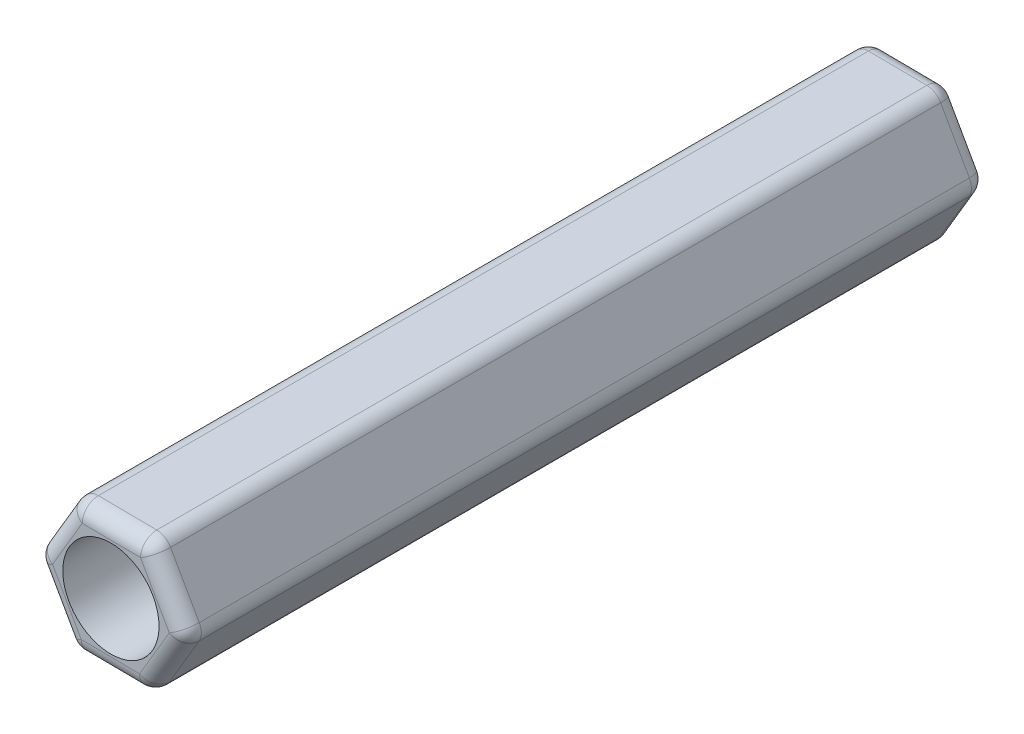
ISO-10303-21;
HEADER;
FILE_DESCRIPTION(('STEP AP214'),'2;1');
FILE_NAME('part.step','',(''),(''),'','','');
FILE_SCHEMA(('AUTOMOTIVE_DESIGN { 1 0 10303 214 1 1 1 1 }'));
ENDSEC;
DATA;
#1=APPLICATION_CONTEXT('core data for automotive mechanical design processes');
#2=APPLICATION_PROTOCOL_DEFINITION('international standard','automotive_design',2000,#1);
#3=PRODUCT_CONTEXT('',#1,'mechanical');
#4=PRODUCT('Part','Part','',(#3));
#5=PRODUCT_RELATED_PRODUCT_CATEGORY('part','',(#4));
#6=PRODUCT_DEFINITION_FORMATION('','',#4);
#7=PRODUCT_DEFINITION_CONTEXT('part definition',#1,'design');
#8=PRODUCT_DEFINITION('design','',#6,#7);
#9=PRODUCT_DEFINITION_SHAPE('','',#8);
#10=(LENGTH_UNIT() NAMED_UNIT(*) SI_UNIT(.MILLI.,.METRE.));
#11=(NAMED_UNIT(*) PLANE_ANGLE_UNIT() SI_UNIT($,.RADIAN.));
#12=(NAMED_UNIT(*) SI_UNIT($,.STERADIAN.) SOLID_ANGLE_UNIT());
#13=UNCERTAINTY_MEASURE_WITH_UNIT(LENGTH_MEASURE(1.E-05),#10,'distance_accuracy_value','');
#14=(GEOMETRIC_REPRESENTATION_CONTEXT(3) GLOBAL_UNCERTAINTY_ASSIGNED_CONTEXT((#13)) GLOBAL_UNIT_ASSIGNED_CONTEXT((#10,
#11,#12)) REPRESENTATION_CONTEXT('',''));
#15=CARTESIAN_POINT('',(0.,0.,0.));
#16=DIRECTION('',(0.,0.,1.));
#17=DIRECTION('',(1.,0.,0.));
#18=AXIS2_PLACEMENT_3D('',#15,#16,#17);
#19=CARTESIAN_POINT('',(-1.21773260801351,-2.06348264560523,25.));
#20=DIRECTION('',(0.0095350652187517,0.999954540232342,0.));
#21=DIRECTION('',(-0.999954540232342,0.0095350652187517,0.));
#22=AXIS2_PLACEMENT_3D('',#19,#20,#21);
#23=PLANE('',#22);
#24=DIRECTION('',(0.,0.,-1.));
#25=VECTOR('',#24,1.);
#26=CARTESIAN_POINT('',(0.889500075865425,-2.0835761601236,25.));
#27=LINE('',#26,#25);
#28=CARTESIAN_POINT('',(0.889500075865425,-2.0835761601236,0.5));
#29=VERTEX_POINT('',#28);
#30=CARTESIAN_POINT('',(0.889500075865425,-2.0835761601236,24.5));
#31=VERTEX_POINT('',#30);
#32=EDGE_CURVE('E240',#29,#31,#27,.F.);
#33=ORIENTED_EDGE('',*,*,#32,.T.);
#34=DIRECTION('',(0.999954540232342,-0.0095350652187517,0.));
#35=VECTOR('',#34,1.);
#36=CARTESIAN_POINT('',(-1.21773260801351,-2.06348264560523,24.5));
#37=LINE('',#36,#35);
#38=CARTESIAN_POINT('',(-0.929070596523247,-2.06623518184062,24.5));
#39=VERTEX_POINT('',#38);
#40=EDGE_CURVE('E242',#31,#39,#37,.F.);
#41=ORIENTED_EDGE('',*,*,#40,.T.);
#42=DIRECTION('',(0.,0.,-1.));
#43=VECTOR('',#42,1.);
#44=CARTESIAN_POINT('',(-0.929070596523247,-2.06623518184062,25.));
#45=LINE('',#44,#43);
#46=CARTESIAN_POINT('',(-0.929070596523247,-2.06623518184062,0.5));
#47=VERTEX_POINT('',#46);
#48=EDGE_CURVE('E236',#39,#47,#45,.T.);
#49=ORIENTED_EDGE('',*,*,#48,.T.);
#50=DIRECTION('',(0.999954540232342,-0.0095350652187517,0.));
#51=VECTOR('',#50,1.);
#52=CARTESIAN_POINT('',(-1.21773260801351,-2.06348264560523,0.5));
#53=LINE('',#52,#51);
#54=EDGE_CURVE('E238',#47,#29,#53,.T.);
#55=ORIENTED_EDGE('',*,*,#54,.T.);
#56=EDGE_LOOP('',(#33,#41,#49,#55));
#57=FACE_BOUND('',#56,.T.);
#58=ADVANCED_FACE('F32',(#57),#23,.F.);
#59=CARTESIAN_POINT('',(1.17816208735569,-2.08632869635899,25.));
#60=DIRECTION('',(-0.861218501861421,0.508234878822351,0.));
#61=DIRECTION('',(-0.508234878822351,-0.861218501861421,0.));
#62=AXIS2_PLACEMENT_3D('',#59,#60,#61);
#63=PLANE('',#62);
#64=DIRECTION('',(0.,0.,-1.));
#65=VECTOR('',#64,1.);
#66=CARTESIAN_POINT('',(2.24917992331938,-0.271458417694153,25.));
#67=LINE('',#66,#65);
#68=CARTESIAN_POINT('',(2.24917992331938,-0.271458417694153,0.5));
#69=VERTEX_POINT('',#68);
#70=CARTESIAN_POINT('',(2.24917992331938,-0.271458417694153,24.5));
#71=VERTEX_POINT('',#70);
#72=EDGE_CURVE('E231',#69,#71,#67,.F.);
#73=ORIENTED_EDGE('',*,*,#72,.T.);
#74=DIRECTION('',(0.508234878822351,0.861218501861421,0.));
#75=VECTOR('',#74,1.);
#76=CARTESIAN_POINT('',(1.17816208735569,-2.08632869635899,24.5));
#77=LINE('',#76,#75);
#78=CARTESIAN_POINT('',(1.32487685940551,-1.83771632941861,24.5));
#79=VERTEX_POINT('',#78);
#80=EDGE_CURVE('E233',#71,#79,#77,.F.);
#81=ORIENTED_EDGE('',*,*,#80,.T.);
#82=DIRECTION('',(0.,0.,-1.));
#83=VECTOR('',#82,1.);
#84=CARTESIAN_POINT('',(1.32487685940551,-1.83771632941861,25.));
#85=LINE('',#84,#83);
#86=CARTESIAN_POINT('',(1.32487685940551,-1.83771632941861,0.5));
#87=VERTEX_POINT('',#86);
#88=EDGE_CURVE('E227',#79,#87,#85,.T.);
#89=ORIENTED_EDGE('',*,*,#88,.T.);
#90=DIRECTION('',(0.508234878822351,0.861218501861421,0.));
#91=VECTOR('',#90,1.);
#92=CARTESIAN_POINT('',(1.17816208735569,-2.08632869635899,0.5));
#93=LINE('',#92,#91);
#94=EDGE_CURVE('E229',#87,#69,#93,.T.);
#95=ORIENTED_EDGE('',*,*,#94,.T.);
#96=EDGE_LOOP('',(#73,#81,#89,#95));
#97=FACE_BOUND('',#96,.T.);
#98=ADVANCED_FACE('F447',(#97),#63,.F.);
#99=CARTESIAN_POINT('',(2.3958946953692,-0.0228460507537645,25.));
#100=DIRECTION('',(-0.870753567080172,-0.49171966140999,0.));
#101=DIRECTION('',(0.49171966140999,-0.870753567080172,0.));
#102=AXIS2_PLACEMENT_3D('',#99,#100,#101);
#103=PLANE('',#102);
#104=DIRECTION('',(0.,0.,-1.));
#105=VECTOR('',#104,1.);
#106=CARTESIAN_POINT('',(1.35967984745396,1.81211774242945,25.));
#107=LINE('',#106,#105);
#108=CARTESIAN_POINT('',(1.35967984745396,1.81211774242945,0.5));
#109=VERTEX_POINT('',#108);
#110=CARTESIAN_POINT('',(1.35967984745396,1.81211774242945,24.5));
#111=VERTEX_POINT('',#110);
#112=EDGE_CURVE('E222',#109,#111,#107,.F.);
#113=ORIENTED_EDGE('',*,*,#112,.T.);
#114=DIRECTION('',(-0.49171966140999,0.870753567080172,0.));
#115=VECTOR('',#114,1.);
#116=CARTESIAN_POINT('',(2.3958946953692,-0.0228460507537646,24.5));
#117=LINE('',#116,#115);
#118=CARTESIAN_POINT('',(2.25394745592876,0.228518852422018,24.5));
#119=VERTEX_POINT('',#118);
#120=EDGE_CURVE('E224',#111,#119,#117,.F.);
#121=ORIENTED_EDGE('',*,*,#120,.T.);
#122=DIRECTION('',(0.,0.,-1.));
#123=VECTOR('',#122,1.);
#124=CARTESIAN_POINT('',(2.25394745592876,0.228518852422018,25.));
#125=LINE('',#124,#123);
#126=CARTESIAN_POINT('',(2.25394745592876,0.228518852422018,0.5));
#127=VERTEX_POINT('',#126);
#128=EDGE_CURVE('E218',#119,#127,#125,.T.);
#129=ORIENTED_EDGE('',*,*,#128,.T.);
#130=DIRECTION('',(-0.49171966140999,0.870753567080172,0.));
#131=VECTOR('',#130,1.);
#132=CARTESIAN_POINT('',(2.3958946953692,-0.0228460507537645,0.5));
#133=LINE('',#132,#131);
#134=EDGE_CURVE('E220',#127,#109,#133,.T.);
#135=ORIENTED_EDGE('',*,*,#134,.T.);
#136=EDGE_LOOP('',(#113,#121,#129,#135));
#137=FACE_BOUND('',#136,.T.);
#138=ADVANCED_FACE('F452',(#137),#103,.F.);
#139=CARTESIAN_POINT('',(1.21773260801351,2.06348264560523,25.));
#140=DIRECTION('',(-0.00953506521875152,-0.999954540232342,0.));
#141=DIRECTION('',(0.999954540232342,-0.00953506521875152,0.));
#142=AXIS2_PLACEMENT_3D('',#139,#140,#141);
#143=PLANE('',#142);
#144=DIRECTION('',(-0.999954540232342,0.00953506521875152,0.));
#145=VECTOR('',#144,1.);
#146=CARTESIAN_POINT('',(1.21773260801351,2.06348264560523,24.5));
#147=LINE('',#146,#145);
#148=CARTESIAN_POINT('',(-0.889500075865427,2.0835761601236,24.5));
#149=VERTEX_POINT('',#148);
#150=CARTESIAN_POINT('',(0.929070596523245,2.06623518184062,24.5));
#151=VERTEX_POINT('',#150);
#152=EDGE_CURVE('E164',#149,#151,#147,.F.);
#153=ORIENTED_EDGE('',*,*,#152,.T.);
#154=DIRECTION('',(0.,0.,-1.));
#155=VECTOR('',#154,1.);
#156=CARTESIAN_POINT('',(0.929070596523245,2.06623518184062,25.));
#157=LINE('',#156,#155);
#158=CARTESIAN_POINT('',(0.929070596523245,2.06623518184062,0.5));
#159=VERTEX_POINT('',#158);
#160=EDGE_CURVE('E203',#151,#159,#157,.T.);
#161=ORIENTED_EDGE('',*,*,#160,.T.);
#162=DIRECTION('',(-0.999954540232342,0.00953506521875152,0.));
#163=VECTOR('',#162,1.);
#164=CARTESIAN_POINT('',(1.21773260801351,2.06348264560523,0.5));
#165=LINE('',#164,#163);
#166=CARTESIAN_POINT('',(-0.889500075865427,2.0835761601236,0.5));
#167=VERTEX_POINT('',#166);
#168=EDGE_CURVE('E195',#159,#167,#165,.T.);
#169=ORIENTED_EDGE('',*,*,#168,.T.);
#170=DIRECTION('',(0.,0.,-1.));
#171=VECTOR('',#170,1.);
#172=CARTESIAN_POINT('',(-0.889500075865427,2.0835761601236,25.));
#173=LINE('',#172,#171);
#174=EDGE_CURVE('E193',#167,#149,#173,.F.);
#175=ORIENTED_EDGE('',*,*,#174,.T.);
#176=EDGE_LOOP('',(#153,#161,#169,#175));
#177=FACE_BOUND('',#176,.T.);
#178=ADVANCED_FACE('F387',(#177),#143,.F.);
#179=CARTESIAN_POINT('',(-1.17816208735569,2.08632869635899,25.));
#180=DIRECTION('',(0.861218501861421,-0.508234878822351,0.));
#181=DIRECTION('',(0.508234878822351,0.861218501861421,0.));
#182=AXIS2_PLACEMENT_3D('',#179,#180,#181);
#183=PLANE('',#182);
#184=DIRECTION('',(-0.508234878822351,-0.861218501861421,0.));
#185=VECTOR('',#184,1.);
#186=CARTESIAN_POINT('',(-1.17816208735569,2.08632869635899,24.5));
#187=LINE('',#186,#185);
#188=CARTESIAN_POINT('',(-2.24917992331939,0.271458417694154,24.5));
#189=VERTEX_POINT('',#188);
#190=CARTESIAN_POINT('',(-1.32487685940551,1.83771632941861,24.5));
#191=VERTEX_POINT('',#190);
#192=EDGE_CURVE('E41',#189,#191,#187,.F.);
#193=ORIENTED_EDGE('',*,*,#192,.T.);
#194=DIRECTION('',(0.,0.,-1.));
#195=VECTOR('',#194,1.);
#196=CARTESIAN_POINT('',(-1.32487685940551,1.83771632941861,25.));
#197=LINE('',#196,#195);
#198=CARTESIAN_POINT('',(-1.32487685940551,1.83771632941861,0.5));
#199=VERTEX_POINT('',#198);
#200=EDGE_CURVE('E11',#191,#199,#197,.T.);
#201=ORIENTED_EDGE('',*,*,#200,.T.);
#202=DIRECTION('',(-0.508234878822351,-0.861218501861421,0.));
#203=VECTOR('',#202,1.);
#204=CARTESIAN_POINT('',(-1.17816208735569,2.08632869635899,0.5));
#205=LINE('',#204,#203);
#206=CARTESIAN_POINT('',(-2.24917992331939,0.271458417694154,0.5));
#207=VERTEX_POINT('',#206);
#208=EDGE_CURVE('E254',#199,#207,#205,.T.);
#209=ORIENTED_EDGE('',*,*,#208,.T.);
#210=DIRECTION('',(0.,0.,-1.));
#211=VECTOR('',#210,1.);
#212=CARTESIAN_POINT('',(-2.24917992331939,0.271458417694153,25.));
#213=LINE('',#212,#211);
#214=EDGE_CURVE('E52',#207,#189,#213,.F.);
#215=ORIENTED_EDGE('',*,*,#214,.T.);
#216=EDGE_LOOP('',(#193,#201,#209,#215));
#217=FACE_BOUND('',#216,.T.);
#218=ADVANCED_FACE('F393',(#217),#183,.F.);
#219=CARTESIAN_POINT('',(-2.39589469536921,0.0228460507537649,25.));
#220=DIRECTION('',(0.870753567080172,0.491719661409991,0.));
#221=DIRECTION('',(-0.491719661409991,0.870753567080172,0.));
#222=AXIS2_PLACEMENT_3D('',#219,#220,#221);
#223=PLANE('',#222);
#224=DIRECTION('',(0.,0.,-1.));
#225=VECTOR('',#224,1.);
#226=CARTESIAN_POINT('',(-1.35967984745396,-1.81211774242945,25.));
#227=LINE('',#226,#225);
#228=CARTESIAN_POINT('',(-1.35967984745396,-1.81211774242945,0.5));
#229=VERTEX_POINT('',#228);
#230=CARTESIAN_POINT('',(-1.35967984745396,-1.81211774242945,24.5));
#231=VERTEX_POINT('',#230);
#232=EDGE_CURVE('E249',#229,#231,#227,.F.);
#233=ORIENTED_EDGE('',*,*,#232,.T.);
#234=DIRECTION('',(0.491719661409991,-0.870753567080172,0.));
#235=VECTOR('',#234,1.);
#236=CARTESIAN_POINT('',(-2.39589469536921,0.0228460507537649,24.5));
#237=LINE('',#236,#235);
#238=CARTESIAN_POINT('',(-2.25394745592876,-0.228518852422018,24.5));
#239=VERTEX_POINT('',#238);
#240=EDGE_CURVE('E251',#231,#239,#237,.F.);
#241=ORIENTED_EDGE('',*,*,#240,.T.);
#242=DIRECTION('',(0.,0.,-1.));
#243=VECTOR('',#242,1.);
#244=CARTESIAN_POINT('',(-2.25394745592876,-0.228518852422018,25.));
#245=LINE('',#244,#243);
#246=CARTESIAN_POINT('',(-2.25394745592876,-0.228518852422018,0.5));
#247=VERTEX_POINT('',#246);
#248=EDGE_CURVE('E245',#239,#247,#245,.T.);
#249=ORIENTED_EDGE('',*,*,#248,.T.);
#250=DIRECTION('',(0.491719661409991,-0.870753567080172,0.));
#251=VECTOR('',#250,1.);
#252=CARTESIAN_POINT('',(-2.39589469536921,0.0228460507537649,0.5));
#253=LINE('',#252,#251);
#254=EDGE_CURVE('E247',#247,#229,#253,.T.);
#255=ORIENTED_EDGE('',*,*,#254,.T.);
#256=EDGE_LOOP('',(#233,#241,#249,#255));
#257=FACE_BOUND('',#256,.T.);
#258=ADVANCED_FACE('F717',(#257),#223,.F.);
#259=CARTESIAN_POINT('',(0.,0.,25.));
#260=DIRECTION('',(0.,0.,1.));
#261=DIRECTION('',(1.,0.,0.));
#262=AXIS2_PLACEMENT_3D('',#259,#260,#261);
#263=PLANE('',#262);
#264=DIRECTION('',(-0.49171966140999,0.870753567080172,0.));
#265=VECTOR('',#264,1.);
#266=CARTESIAN_POINT('',(0.782355824473424,1.81762281490023,25.));
#267=LINE('',#266,#265);
#268=CARTESIAN_POINT('',(1.81857067238867,-0.0173409782829781,25.));
#269=VERTEX_POINT('',#268);
#270=CARTESIAN_POINT('',(0.924303063913868,1.56625791172445,25.));
#271=VERTEX_POINT('',#270);
#272=EDGE_CURVE('E191',#269,#271,#267,.T.);
#273=ORIENTED_EDGE('',*,*,#272,.T.);
#274=DIRECTION('',(-0.999954540232342,0.00953506521875152,0.));
#275=VECTOR('',#274,1.);
#276=CARTESIAN_POINT('',(-1.18292961996507,1.58635142624282,25.));
#277=LINE('',#276,#275);
#278=CARTESIAN_POINT('',(-0.894267608474803,1.58359889000743,25.));
#279=VERTEX_POINT('',#278);
#280=EDGE_CURVE('E162',#271,#279,#277,.T.);
#281=ORIENTED_EDGE('',*,*,#280,.T.);
#282=DIRECTION('',(-0.508234878822351,-0.861218501861421,0.));
#283=VECTOR('',#282,1.);
#284=CARTESIAN_POINT('',(-1.9652854444385,-0.231271388657411,25.));
#285=LINE('',#284,#283);
#286=CARTESIAN_POINT('',(-1.81857067238867,0.0173409782829782,25.));
#287=VERTEX_POINT('',#286);
#288=EDGE_CURVE('E179',#279,#287,#285,.T.);
#289=ORIENTED_EDGE('',*,*,#288,.T.);
#290=DIRECTION('',(0.491719661409991,-0.870753567080172,0.));
#291=VECTOR('',#290,1.);
#292=CARTESIAN_POINT('',(-0.782355824473426,-1.81762281490023,25.));
#293=LINE('',#292,#291);
#294=CARTESIAN_POINT('',(-0.924303063913871,-1.56625791172445,25.));
#295=VERTEX_POINT('',#294);
#296=EDGE_CURVE('E185',#287,#295,#293,.T.);
#297=ORIENTED_EDGE('',*,*,#296,.T.);
#298=DIRECTION('',(0.999954540232342,-0.0095350652187517,0.));
#299=VECTOR('',#298,1.);
#300=CARTESIAN_POINT('',(1.18292961996507,-1.58635142624282,25.));
#301=LINE('',#300,#299);
#302=CARTESIAN_POINT('',(0.894267608474801,-1.58359889000743,25.));
#303=VERTEX_POINT('',#302);
#304=EDGE_CURVE('E360',#295,#303,#301,.T.);
#305=ORIENTED_EDGE('',*,*,#304,.T.);
#306=DIRECTION('',(0.508234878822351,0.861218501861421,0.));
#307=VECTOR('',#306,1.);
#308=CARTESIAN_POINT('',(1.96528544443849,0.231271388657411,25.));
#309=LINE('',#308,#307);
#310=EDGE_CURVE('E197',#303,#269,#309,.T.);
#311=ORIENTED_EDGE('',*,*,#310,.T.);
#312=EDGE_LOOP('',(#273,#281,#289,#297,#305,#311));
#313=FACE_BOUND('',#312,.T.);
#314=CARTESIAN_POINT('',(0.,0.,25.));
#315=DIRECTION('',(0.,0.,1.));
#316=DIRECTION('',(1.,0.,0.));
#317=AXIS2_PLACEMENT_3D('',#314,#315,#316);
#318=CIRCLE('',#317,1.5);
#319=CARTESIAN_POINT('',(1.5,0.,25.));
#320=VERTEX_POINT('',#319);
#321=EDGE_CURVE('E347',#320,#320,#318,.T.);
#322=ORIENTED_EDGE('',*,*,#321,.F.);
#323=EDGE_LOOP('',(#322));
#324=FACE_BOUND('',#323,.T.);
#325=ADVANCED_FACE('F188',(#313,#324),#263,.T.);
#326=CARTESIAN_POINT('',(0.,0.,0.));
#327=DIRECTION('',(0.,0.,1.));
#328=DIRECTION('',(1.,0.,0.));
#329=AXIS2_PLACEMENT_3D('',#326,#327,#328);
#330=PLANE('',#329);
#331=DIRECTION('',(-0.508234878822351,-0.861218501861421,0.));
#332=VECTOR('',#331,1.);
#333=CARTESIAN_POINT('',(-1.35641914043174,0.800469934145204,0.));
#334=LINE('',#333,#332);
#335=CARTESIAN_POINT('',(-1.81857067238867,0.0173409782829779,0.));
#336=VERTEX_POINT('',#335);
#337=CARTESIAN_POINT('',(-0.894267608474802,1.58359889000743,0.));
#338=VERTEX_POINT('',#337);
#339=EDGE_CURVE('E205',#336,#338,#334,.F.);
#340=ORIENTED_EDGE('',*,*,#339,.T.);
#341=DIRECTION('',(-0.999954540232342,0.00953506521875152,0.));
#342=VECTOR('',#341,1.);
#343=CARTESIAN_POINT('',(0.0150177277195337,1.57492840086594,0.));
#344=LINE('',#343,#342);
#345=CARTESIAN_POINT('',(0.924303063913869,1.56625791172445,0.));
#346=VERTEX_POINT('',#345);
#347=EDGE_CURVE('E215',#338,#346,#344,.F.);
#348=ORIENTED_EDGE('',*,*,#347,.T.);
#349=DIRECTION('',(-0.49171966140999,0.870753567080172,0.));
#350=VECTOR('',#349,1.);
#351=CARTESIAN_POINT('',(1.37143686815127,0.774458466720735,0.));
#352=LINE('',#351,#350);
#353=CARTESIAN_POINT('',(1.81857067238867,-0.0173409782829776,0.));
#354=VERTEX_POINT('',#353);
#355=EDGE_CURVE('E213',#346,#354,#352,.F.);
#356=ORIENTED_EDGE('',*,*,#355,.T.);
#357=DIRECTION('',(0.508234878822351,0.861218501861421,0.));
#358=VECTOR('',#357,1.);
#359=CARTESIAN_POINT('',(1.35641914043174,-0.800469934145203,0.));
#360=LINE('',#359,#358);
#361=CARTESIAN_POINT('',(0.894267608474801,-1.58359889000743,0.));
#362=VERTEX_POINT('',#361);
#363=EDGE_CURVE('E211',#354,#362,#360,.F.);
#364=ORIENTED_EDGE('',*,*,#363,.T.);
#365=DIRECTION('',(0.999954540232342,-0.0095350652187517,0.));
#366=VECTOR('',#365,1.);
#367=CARTESIAN_POINT('',(-0.0150177277195339,-1.57492840086594,0.));
#368=LINE('',#367,#366);
#369=CARTESIAN_POINT('',(-0.924303063913871,-1.56625791172445,0.));
#370=VERTEX_POINT('',#369);
#371=EDGE_CURVE('E209',#362,#370,#368,.F.);
#372=ORIENTED_EDGE('',*,*,#371,.T.);
#373=DIRECTION('',(0.491719661409991,-0.870753567080172,0.));
#374=VECTOR('',#373,1.);
#375=CARTESIAN_POINT('',(-1.37143686815127,-0.774458466720736,0.));
#376=LINE('',#375,#374);
#377=EDGE_CURVE('E207',#370,#336,#376,.F.);
#378=ORIENTED_EDGE('',*,*,#377,.T.);
#379=EDGE_LOOP('',(#340,#348,#356,#364,#372,#378));
#380=FACE_BOUND('',#379,.T.);
#381=CARTESIAN_POINT('',(0.,0.,0.));
#382=DIRECTION('',(0.,0.,1.));
#383=DIRECTION('',(1.,0.,0.));
#384=AXIS2_PLACEMENT_3D('',#381,#382,#383);
#385=CIRCLE('',#384,1.5);
#386=CARTESIAN_POINT('',(1.5,0.,0.));
#387=VERTEX_POINT('',#386);
#388=EDGE_CURVE('E186',#387,#387,#385,.T.);
#389=ORIENTED_EDGE('',*,*,#388,.T.);
#390=EDGE_LOOP('',(#389));
#391=FACE_BOUND('',#390,.T.);
#392=ADVANCED_FACE('F701',(#380,#391),#330,.F.);
#393=CARTESIAN_POINT('',(0.,0.,0.));
#394=DIRECTION('',(0.,0.,1.));
#395=DIRECTION('',(1.,0.,0.));
#396=AXIS2_PLACEMENT_3D('',#393,#394,#395);
#397=CYLINDRICAL_SURFACE('',#396,1.5);
#398=ORIENTED_EDGE('',*,*,#388,.F.);
#399=EDGE_LOOP('',(#398));
#400=FACE_BOUND('',#399,.T.);
#401=ORIENTED_EDGE('',*,*,#321,.T.);
#402=EDGE_LOOP('',(#401));
#403=FACE_BOUND('',#402,.T.);
#404=ADVANCED_FACE('F692',(#400,#403),#397,.F.);
#405=CARTESIAN_POINT('',(-1.21296507540414,-1.56350537548906,0.5));
#406=DIRECTION('',(0.999954540232342,-0.0095350652187517,0.));
#407=DIRECTION('',(0.0095350652187517,0.999954540232342,0.));
#408=AXIS2_PLACEMENT_3D('',#405,#406,#407);
#409=CYLINDRICAL_SURFACE('',#408,0.5);
#410=CARTESIAN_POINT('',(0.894267608474801,-1.58359889000743,0.5));
#411=DIRECTION('',(0.999954540232342,-0.00953506521875159,0.));
#412=DIRECTION('',(0.00953506521875159,0.999954540232342,0.));
#413=AXIS2_PLACEMENT_3D('',#410,#411,#412);
#414=CIRCLE('',#413,0.5);
#415=EDGE_CURVE('E36',#29,#362,#414,.T.);
#416=ORIENTED_EDGE('',*,*,#415,.F.);
#417=ORIENTED_EDGE('',*,*,#54,.F.);
#418=CARTESIAN_POINT('',(-0.924303063913871,-1.56625791172445,0.5));
#419=DIRECTION('',(-0.999954540232342,0.00953506521875224,0.));
#420=DIRECTION('',(-0.00953506521875225,-0.999954540232342,0.));
#421=AXIS2_PLACEMENT_3D('',#418,#419,#420);
#422=CIRCLE('',#421,0.5);
#423=EDGE_CURVE('E340',#370,#47,#422,.T.);
#424=ORIENTED_EDGE('',*,*,#423,.F.);
#425=ORIENTED_EDGE('',*,*,#371,.F.);
#426=EDGE_LOOP('',(#416,#417,#424,#425));
#427=FACE_BOUND('',#426,.T.);
#428=ADVANCED_FACE('F34',(#427),#409,.T.);
#429=CARTESIAN_POINT('',(0.894267608474801,-1.58359889000743,0.5));
#430=DIRECTION('',(0.,0.,1.));
#431=DIRECTION('',(1.,0.,0.));
#432=AXIS2_PLACEMENT_3D('',#429,#430,#431);
#433=SPHERICAL_SURFACE('',#432,0.5);
#434=CARTESIAN_POINT('',(0.894267608474801,-1.58359889000743,0.5));
#435=DIRECTION('',(0.,0.,-1.));
#436=DIRECTION('',(-1.,0.,0.));
#437=AXIS2_PLACEMENT_3D('',#434,#435,#436);
#438=CIRCLE('',#437,0.5);
#439=EDGE_CURVE('E335',#29,#87,#438,.F.);
#440=ORIENTED_EDGE('',*,*,#439,.F.);
#441=ORIENTED_EDGE('',*,*,#415,.T.);
#442=CARTESIAN_POINT('',(0.894267608474801,-1.58359889000743,0.5));
#443=DIRECTION('',(-0.508234878822351,-0.861218501861421,0.));
#444=DIRECTION('',(0.861218501861421,-0.508234878822351,0.));
#445=AXIS2_PLACEMENT_3D('',#442,#443,#444);
#446=CIRCLE('',#445,0.5);
#447=EDGE_CURVE('E338',#87,#362,#446,.F.);
#448=ORIENTED_EDGE('',*,*,#447,.F.);
#449=EDGE_LOOP('',(#440,#441,#448));
#450=FACE_BOUND('',#449,.T.);
#451=ADVANCED_FACE('F678',(#450),#433,.T.);
#452=CARTESIAN_POINT('',(-0.924303063913871,-1.56625791172445,0.5));
#453=DIRECTION('',(0.,0.,1.));
#454=DIRECTION('',(1.,0.,0.));
#455=AXIS2_PLACEMENT_3D('',#452,#453,#454);
#456=SPHERICAL_SURFACE('',#455,0.5);
#457=CARTESIAN_POINT('',(-0.924303063913871,-1.56625791172445,0.5));
#458=DIRECTION('',(0.491719661409991,-0.870753567080172,0.));
#459=DIRECTION('',(0.870753567080172,0.491719661409991,0.));
#460=AXIS2_PLACEMENT_3D('',#457,#458,#459);
#461=CIRCLE('',#460,0.5);
#462=EDGE_CURVE('E329',#370,#229,#461,.F.);
#463=ORIENTED_EDGE('',*,*,#462,.F.);
#464=ORIENTED_EDGE('',*,*,#423,.T.);
#465=CARTESIAN_POINT('',(-0.924303063913871,-1.56625791172445,0.5));
#466=DIRECTION('',(0.,0.,-1.));
#467=DIRECTION('',(-1.,0.,0.));
#468=AXIS2_PLACEMENT_3D('',#465,#466,#467);
#469=CIRCLE('',#468,0.5);
#470=EDGE_CURVE('E332',#229,#47,#469,.F.);
#471=ORIENTED_EDGE('',*,*,#470,.F.);
#472=EDGE_LOOP('',(#463,#464,#471));
#473=FACE_BOUND('',#472,.T.);
#474=ADVANCED_FACE('F669',(#473),#456,.T.);
#475=CARTESIAN_POINT('',(0.74755283642498,-1.83221125694782,0.5));
#476=DIRECTION('',(0.508234878822351,0.861218501861421,0.));
#477=DIRECTION('',(-0.861218501861421,0.508234878822351,0.));
#478=AXIS2_PLACEMENT_3D('',#475,#476,#477);
#479=CYLINDRICAL_SURFACE('',#478,0.5);
#480=ORIENTED_EDGE('',*,*,#447,.T.);
#481=ORIENTED_EDGE('',*,*,#363,.F.);
#482=CARTESIAN_POINT('',(1.81857067238867,-0.0173409782829775,0.5));
#483=DIRECTION('',(0.508234878822351,0.861218501861421,0.));
#484=DIRECTION('',(-0.861218501861421,0.508234878822351,0.));
#485=AXIS2_PLACEMENT_3D('',#482,#483,#484);
#486=CIRCLE('',#485,0.5);
#487=EDGE_CURVE('E326',#69,#354,#486,.T.);
#488=ORIENTED_EDGE('',*,*,#487,.F.);
#489=ORIENTED_EDGE('',*,*,#94,.F.);
#490=EDGE_LOOP('',(#480,#481,#488,#489));
#491=FACE_BOUND('',#490,.T.);
#492=ADVANCED_FACE('F661',(#491),#479,.T.);
#493=CARTESIAN_POINT('',(0.894267608474801,-1.58359889000743,25.));
#494=DIRECTION('',(0.,0.,-1.));
#495=DIRECTION('',(-1.,0.,0.));
#496=AXIS2_PLACEMENT_3D('',#493,#494,#495);
#497=CYLINDRICAL_SURFACE('',#496,0.5);
#498=ORIENTED_EDGE('',*,*,#439,.T.);
#499=ORIENTED_EDGE('',*,*,#88,.F.);
#500=CARTESIAN_POINT('',(0.894267608474801,-1.58359889000743,24.5));
#501=DIRECTION('',(0.,0.,1.));
#502=DIRECTION('',(1.,0.,0.));
#503=AXIS2_PLACEMENT_3D('',#500,#501,#502);
#504=CIRCLE('',#503,0.5);
#505=EDGE_CURVE('E323',#31,#79,#504,.T.);
#506=ORIENTED_EDGE('',*,*,#505,.F.);
#507=ORIENTED_EDGE('',*,*,#32,.F.);
#508=EDGE_LOOP('',(#498,#499,#506,#507));
#509=FACE_BOUND('',#508,.T.);
#510=ADVANCED_FACE('F432',(#509),#497,.T.);
#511=CARTESIAN_POINT('',(-0.0150177277195339,-1.57492840086594,24.5));
#512=DIRECTION('',(-0.999954540232342,0.0095350652187517,0.));
#513=DIRECTION('',(-0.0095350652187517,-0.999954540232342,0.));
#514=AXIS2_PLACEMENT_3D('',#511,#512,#513);
#515=CYLINDRICAL_SURFACE('',#514,0.5);
#516=CARTESIAN_POINT('',(-0.924303063913871,-1.56625791172445,24.5));
#517=DIRECTION('',(-0.999954540232342,0.00953506521875159,0.));
#518=DIRECTION('',(-0.00953506521875159,-0.999954540232342,0.));
#519=AXIS2_PLACEMENT_3D('',#516,#517,#518);
#520=CIRCLE('',#519,0.5);
#521=EDGE_CURVE('E317',#39,#295,#520,.T.);
#522=ORIENTED_EDGE('',*,*,#521,.F.);
#523=ORIENTED_EDGE('',*,*,#40,.F.);
#524=CARTESIAN_POINT('',(0.894267608474801,-1.58359889000743,24.5));
#525=DIRECTION('',(0.999954540232342,-0.00953506521875159,0.));
#526=DIRECTION('',(0.00953506521875159,0.999954540232342,0.));
#527=AXIS2_PLACEMENT_3D('',#524,#525,#526);
#528=CIRCLE('',#527,0.5);
#529=EDGE_CURVE('E320',#303,#31,#528,.T.);
#530=ORIENTED_EDGE('',*,*,#529,.F.);
#531=ORIENTED_EDGE('',*,*,#304,.F.);
#532=EDGE_LOOP('',(#522,#523,#530,#531));
#533=FACE_BOUND('',#532,.T.);
#534=ADVANCED_FACE('F416',(#533),#515,.T.);
#535=CARTESIAN_POINT('',(-0.924303063913871,-1.56625791172445,25.));
#536=DIRECTION('',(0.,0.,-1.));
#537=DIRECTION('',(-1.,0.,0.));
#538=AXIS2_PLACEMENT_3D('',#535,#536,#537);
#539=CYLINDRICAL_SURFACE('',#538,0.5);
#540=ORIENTED_EDGE('',*,*,#470,.T.);
#541=ORIENTED_EDGE('',*,*,#48,.F.);
#542=CARTESIAN_POINT('',(-0.924303063913871,-1.56625791172445,24.5));
#543=DIRECTION('',(0.,0.,1.));
#544=DIRECTION('',(1.,0.,0.));
#545=AXIS2_PLACEMENT_3D('',#542,#543,#544);
#546=CIRCLE('',#545,0.5);
#547=EDGE_CURVE('E315',#231,#39,#546,.T.);
#548=ORIENTED_EDGE('',*,*,#547,.F.);
#549=ORIENTED_EDGE('',*,*,#232,.F.);
#550=EDGE_LOOP('',(#540,#541,#548,#549));
#551=FACE_BOUND('',#550,.T.);
#552=ADVANCED_FACE('F425',(#551),#539,.T.);
#553=CARTESIAN_POINT('',(-1.96051791182912,0.26870588145876,0.5));
#554=DIRECTION('',(0.491719661409991,-0.870753567080172,0.));
#555=DIRECTION('',(0.870753567080172,0.491719661409991,0.));
#556=AXIS2_PLACEMENT_3D('',#553,#554,#555);
#557=CYLINDRICAL_SURFACE('',#556,0.5);
#558=ORIENTED_EDGE('',*,*,#462,.T.);
#559=ORIENTED_EDGE('',*,*,#254,.F.);
#560=CARTESIAN_POINT('',(-1.81857067238867,0.0173409782829779,0.5));
#561=DIRECTION('',(-0.491719661409991,0.870753567080172,0.));
#562=DIRECTION('',(-0.870753567080172,-0.491719661409992,0.));
#563=AXIS2_PLACEMENT_3D('',#560,#561,#562);
#564=CIRCLE('',#563,0.5);
#565=EDGE_CURVE('E312',#336,#247,#564,.T.);
#566=ORIENTED_EDGE('',*,*,#565,.F.);
#567=ORIENTED_EDGE('',*,*,#377,.F.);
#568=EDGE_LOOP('',(#558,#559,#566,#567));
#569=FACE_BOUND('',#568,.T.);
#570=ADVANCED_FACE('F443',(#569),#557,.T.);
#571=CARTESIAN_POINT('',(1.81857067238867,-0.0173409782829776,0.5));
#572=DIRECTION('',(0.,0.,1.));
#573=DIRECTION('',(1.,0.,0.));
#574=AXIS2_PLACEMENT_3D('',#571,#572,#573);
#575=SPHERICAL_SURFACE('',#574,0.5);
#576=CARTESIAN_POINT('',(1.81857067238867,-0.0173409782829775,0.5));
#577=DIRECTION('',(0.,0.,-1.));
#578=DIRECTION('',(-1.,0.,0.));
#579=AXIS2_PLACEMENT_3D('',#576,#577,#578);
#580=CIRCLE('',#579,0.5);
#581=EDGE_CURVE('E306',#69,#127,#580,.F.);
#582=ORIENTED_EDGE('',*,*,#581,.F.);
#583=ORIENTED_EDGE('',*,*,#487,.T.);
#584=CARTESIAN_POINT('',(1.81857067238867,-0.0173409782829776,0.5));
#585=DIRECTION('',(0.491719661409991,-0.870753567080172,0.));
#586=DIRECTION('',(0.870753567080172,0.491719661409991,0.));
#587=AXIS2_PLACEMENT_3D('',#584,#585,#586);
#588=CIRCLE('',#587,0.5);
#589=EDGE_CURVE('E309',#127,#354,#588,.F.);
#590=ORIENTED_EDGE('',*,*,#589,.F.);
#591=EDGE_LOOP('',(#582,#583,#590));
#592=FACE_BOUND('',#591,.T.);
#593=ADVANCED_FACE('F436',(#592),#575,.T.);
#594=CARTESIAN_POINT('',(0.894267608474801,-1.58359889000743,24.5));
#595=DIRECTION('',(0.,0.,1.));
#596=DIRECTION('',(1.,0.,0.));
#597=AXIS2_PLACEMENT_3D('',#594,#595,#596);
#598=SPHERICAL_SURFACE('',#597,0.5);
#599=ORIENTED_EDGE('',*,*,#529,.T.);
#600=ORIENTED_EDGE('',*,*,#505,.T.);
#601=CARTESIAN_POINT('',(0.894267608474801,-1.58359889000743,24.5));
#602=DIRECTION('',(-0.508234878822351,-0.861218501861421,0.));
#603=DIRECTION('',(0.861218501861421,-0.508234878822351,0.));
#604=AXIS2_PLACEMENT_3D('',#601,#602,#603);
#605=CIRCLE('',#604,0.5);
#606=EDGE_CURVE('E304',#303,#79,#605,.F.);
#607=ORIENTED_EDGE('',*,*,#606,.F.);
#608=EDGE_LOOP('',(#599,#600,#607));
#609=FACE_BOUND('',#608,.T.);
#610=ADVANCED_FACE('F434',(#609),#598,.T.);
#611=CARTESIAN_POINT('',(-0.924303063913871,-1.56625791172445,24.5));
#612=DIRECTION('',(0.,0.,1.));
#613=DIRECTION('',(1.,0.,0.));
#614=AXIS2_PLACEMENT_3D('',#611,#612,#613);
#615=SPHERICAL_SURFACE('',#614,0.5);
#616=ORIENTED_EDGE('',*,*,#547,.T.);
#617=ORIENTED_EDGE('',*,*,#521,.T.);
#618=CARTESIAN_POINT('',(-0.924303063913871,-1.56625791172445,24.5));
#619=DIRECTION('',(0.49171966140999,-0.870753567080172,0.));
#620=DIRECTION('',(0.870753567080172,0.49171966140999,0.));
#621=AXIS2_PLACEMENT_3D('',#618,#619,#620);
#622=CIRCLE('',#621,0.5);
#623=EDGE_CURVE('E301',#231,#295,#622,.F.);
#624=ORIENTED_EDGE('',*,*,#623,.F.);
#625=EDGE_LOOP('',(#616,#617,#624));
#626=FACE_BOUND('',#625,.T.);
#627=ADVANCED_FACE('F421',(#626),#615,.T.);
#628=CARTESIAN_POINT('',(-1.81857067238867,0.017340978282978,0.5));
#629=DIRECTION('',(0.,0.,1.));
#630=DIRECTION('',(1.,0.,0.));
#631=AXIS2_PLACEMENT_3D('',#628,#629,#630);
#632=SPHERICAL_SURFACE('',#631,0.5);
#633=CARTESIAN_POINT('',(-1.81857067238867,0.0173409782829779,0.5));
#634=DIRECTION('',(-0.508234878822351,-0.861218501861421,0.));
#635=DIRECTION('',(0.861218501861421,-0.508234878822351,0.));
#636=AXIS2_PLACEMENT_3D('',#633,#634,#635);
#637=CIRCLE('',#636,0.5);
#638=EDGE_CURVE('E295',#336,#207,#637,.F.);
#639=ORIENTED_EDGE('',*,*,#638,.F.);
#640=ORIENTED_EDGE('',*,*,#565,.T.);
#641=CARTESIAN_POINT('',(-1.81857067238867,0.0173409782829777,0.5));
#642=DIRECTION('',(0.,0.,-1.));
#643=DIRECTION('',(-1.,0.,0.));
#644=AXIS2_PLACEMENT_3D('',#641,#642,#643);
#645=CIRCLE('',#644,0.5);
#646=EDGE_CURVE('E298',#207,#247,#645,.F.);
#647=ORIENTED_EDGE('',*,*,#646,.F.);
#648=EDGE_LOOP('',(#639,#640,#647));
#649=FACE_BOUND('',#648,.T.);
#650=ADVANCED_FACE('F402',(#649),#632,.T.);
#651=CARTESIAN_POINT('',(1.96051791182912,-0.26870588145876,0.5));
#652=DIRECTION('',(-0.49171966140999,0.870753567080172,0.));
#653=DIRECTION('',(-0.870753567080172,-0.49171966140999,0.));
#654=AXIS2_PLACEMENT_3D('',#651,#652,#653);
#655=CYLINDRICAL_SURFACE('',#654,0.5);
#656=ORIENTED_EDGE('',*,*,#589,.T.);
#657=ORIENTED_EDGE('',*,*,#355,.F.);
#658=CARTESIAN_POINT('',(0.924303063913869,1.56625791172445,0.5));
#659=DIRECTION('',(-0.491719661409991,0.870753567080173,0.));
#660=DIRECTION('',(-0.870753567080172,-0.49171966140999,0.));
#661=AXIS2_PLACEMENT_3D('',#658,#659,#660);
#662=CIRCLE('',#661,0.5);
#663=EDGE_CURVE('E290',#109,#346,#662,.T.);
#664=ORIENTED_EDGE('',*,*,#663,.F.);
#665=ORIENTED_EDGE('',*,*,#134,.F.);
#666=EDGE_LOOP('',(#656,#657,#664,#665));
#667=FACE_BOUND('',#666,.T.);
#668=ADVANCED_FACE('F498',(#667),#655,.T.);
#669=CARTESIAN_POINT('',(1.81857067238867,-0.0173409782829776,25.));
#670=DIRECTION('',(0.,0.,-1.));
#671=DIRECTION('',(-1.,0.,0.));
#672=AXIS2_PLACEMENT_3D('',#669,#670,#671);
#673=CYLINDRICAL_SURFACE('',#672,0.5);
#674=ORIENTED_EDGE('',*,*,#581,.T.);
#675=ORIENTED_EDGE('',*,*,#128,.F.);
#676=CARTESIAN_POINT('',(1.81857067238867,-0.0173409782829775,24.5));
#677=DIRECTION('',(0.,0.,1.));
#678=DIRECTION('',(1.,0.,0.));
#679=AXIS2_PLACEMENT_3D('',#676,#677,#678);
#680=CIRCLE('',#679,0.5);
#681=EDGE_CURVE('E287',#71,#119,#680,.T.);
#682=ORIENTED_EDGE('',*,*,#681,.F.);
#683=ORIENTED_EDGE('',*,*,#72,.F.);
#684=EDGE_LOOP('',(#674,#675,#682,#683));
#685=FACE_BOUND('',#684,.T.);
#686=ADVANCED_FACE('F495',(#685),#673,.T.);
#687=CARTESIAN_POINT('',(1.35641914043174,-0.800469934145203,24.5));
#688=DIRECTION('',(-0.508234878822351,-0.861218501861421,0.));
#689=DIRECTION('',(0.861218501861421,-0.508234878822351,0.));
#690=AXIS2_PLACEMENT_3D('',#687,#688,#689);
#691=CYLINDRICAL_SURFACE('',#690,0.5);
#692=ORIENTED_EDGE('',*,*,#606,.T.);
#693=ORIENTED_EDGE('',*,*,#80,.F.);
#694=CARTESIAN_POINT('',(1.81857067238867,-0.0173409782829781,24.5));
#695=DIRECTION('',(0.50823487882235,0.861218501861421,0.));
#696=DIRECTION('',(-0.861218501861421,0.50823487882235,0.));
#697=AXIS2_PLACEMENT_3D('',#694,#695,#696);
#698=CIRCLE('',#697,0.5);
#699=EDGE_CURVE('E284',#269,#71,#698,.T.);
#700=ORIENTED_EDGE('',*,*,#699,.F.);
#701=ORIENTED_EDGE('',*,*,#310,.F.);
#702=EDGE_LOOP('',(#692,#693,#700,#701));
#703=FACE_BOUND('',#702,.T.);
#704=ADVANCED_FACE('F368',(#703),#691,.T.);
#705=CARTESIAN_POINT('',(-1.37143686815127,-0.774458466720736,24.5));
#706=DIRECTION('',(-0.491719661409991,0.870753567080172,0.));
#707=DIRECTION('',(-0.870753567080172,-0.491719661409991,0.));
#708=AXIS2_PLACEMENT_3D('',#705,#706,#707);
#709=CYLINDRICAL_SURFACE('',#708,0.5);
#710=ORIENTED_EDGE('',*,*,#623,.T.);
#711=ORIENTED_EDGE('',*,*,#296,.F.);
#712=CARTESIAN_POINT('',(-1.81857067238867,0.0173409782829776,24.5));
#713=DIRECTION('',(-0.491719661409991,0.870753567080172,0.));
#714=DIRECTION('',(-0.870753567080172,-0.491719661409991,0.));
#715=AXIS2_PLACEMENT_3D('',#712,#713,#714);
#716=CIRCLE('',#715,0.5);
#717=EDGE_CURVE('E281',#239,#287,#716,.T.);
#718=ORIENTED_EDGE('',*,*,#717,.F.);
#719=ORIENTED_EDGE('',*,*,#240,.F.);
#720=EDGE_LOOP('',(#710,#711,#718,#719));
#721=FACE_BOUND('',#720,.T.);
#722=ADVANCED_FACE('F412',(#721),#709,.T.);
#723=CARTESIAN_POINT('',(-1.81857067238867,0.0173409782829776,25.));
#724=DIRECTION('',(0.,0.,-1.));
#725=DIRECTION('',(-1.,0.,0.));
#726=AXIS2_PLACEMENT_3D('',#723,#724,#725);
#727=CYLINDRICAL_SURFACE('',#726,0.5);
#728=ORIENTED_EDGE('',*,*,#646,.T.);
#729=ORIENTED_EDGE('',*,*,#248,.F.);
#730=CARTESIAN_POINT('',(-1.81857067238867,0.0173409782829779,24.5));
#731=DIRECTION('',(0.,0.,1.));
#732=DIRECTION('',(1.,0.,0.));
#733=AXIS2_PLACEMENT_3D('',#730,#731,#732);
#734=CIRCLE('',#733,0.5);
#735=EDGE_CURVE('E279',#189,#239,#734,.T.);
#736=ORIENTED_EDGE('',*,*,#735,.F.);
#737=ORIENTED_EDGE('',*,*,#214,.F.);
#738=EDGE_LOOP('',(#728,#729,#736,#737));
#739=FACE_BOUND('',#738,.T.);
#740=ADVANCED_FACE('F406',(#739),#727,.T.);
#741=CARTESIAN_POINT('',(-0.747552836424982,1.83221125694782,0.5));
#742=DIRECTION('',(-0.508234878822351,-0.861218501861421,0.));
#743=DIRECTION('',(0.861218501861421,-0.508234878822351,0.));
#744=AXIS2_PLACEMENT_3D('',#741,#742,#743);
#745=CYLINDRICAL_SURFACE('',#744,0.5);
#746=ORIENTED_EDGE('',*,*,#638,.T.);
#747=ORIENTED_EDGE('',*,*,#208,.F.);
#748=CARTESIAN_POINT('',(-0.894267608474802,1.58359889000743,0.5));
#749=DIRECTION('',(0.508234878822351,0.861218501861421,0.));
#750=DIRECTION('',(-0.861218501861421,0.508234878822351,0.));
#751=AXIS2_PLACEMENT_3D('',#748,#749,#750);
#752=CIRCLE('',#751,0.5);
#753=EDGE_CURVE('E276',#338,#199,#752,.T.);
#754=ORIENTED_EDGE('',*,*,#753,.F.);
#755=ORIENTED_EDGE('',*,*,#339,.F.);
#756=EDGE_LOOP('',(#746,#747,#754,#755));
#757=FACE_BOUND('',#756,.T.);
#758=ADVANCED_FACE('F400',(#757),#745,.T.);
#759=CARTESIAN_POINT('',(1.21296507540413,1.56350537548906,0.5));
#760=DIRECTION('',(-0.999954540232342,0.00953506521875152,0.));
#761=DIRECTION('',(-0.00953506521875152,-0.999954540232342,0.));
#762=AXIS2_PLACEMENT_3D('',#759,#760,#761);
#763=CYLINDRICAL_SURFACE('',#762,0.5);
#764=CARTESIAN_POINT('',(0.924303063913869,1.56625791172445,0.5));
#765=DIRECTION('',(0.999954540232342,-0.00953506521875203,0.));
#766=DIRECTION('',(0.00953506521875203,0.999954540232342,0.));
#767=AXIS2_PLACEMENT_3D('',#764,#765,#766);
#768=CIRCLE('',#767,0.5);
#769=EDGE_CURVE('E292',#346,#159,#768,.T.);
#770=ORIENTED_EDGE('',*,*,#769,.F.);
#771=ORIENTED_EDGE('',*,*,#347,.F.);
#772=CARTESIAN_POINT('',(-0.894267608474802,1.58359889000743,0.5));
#773=DIRECTION('',(-0.999954540232342,0.00953506521875159,0.));
#774=DIRECTION('',(-0.00953506521875159,-0.999954540232342,0.));
#775=AXIS2_PLACEMENT_3D('',#772,#773,#774);
#776=CIRCLE('',#775,0.5);
#777=EDGE_CURVE('E273',#167,#338,#776,.T.);
#778=ORIENTED_EDGE('',*,*,#777,.F.);
#779=ORIENTED_EDGE('',*,*,#168,.F.);
#780=EDGE_LOOP('',(#770,#771,#778,#779));
#781=FACE_BOUND('',#780,.T.);
#782=ADVANCED_FACE('F482',(#781),#763,.T.);
#783=CARTESIAN_POINT('',(0.924303063913869,1.56625791172445,0.5));
#784=DIRECTION('',(0.,0.,1.));
#785=DIRECTION('',(1.,0.,0.));
#786=AXIS2_PLACEMENT_3D('',#783,#784,#785);
#787=SPHERICAL_SURFACE('',#786,0.5);
#788=ORIENTED_EDGE('',*,*,#663,.T.);
#789=ORIENTED_EDGE('',*,*,#769,.T.);
#790=CARTESIAN_POINT('',(0.924303063913869,1.56625791172445,0.5));
#791=DIRECTION('',(0.,0.,-1.));
#792=DIRECTION('',(-1.,0.,0.));
#793=AXIS2_PLACEMENT_3D('',#790,#791,#792);
#794=CIRCLE('',#793,0.5);
#795=EDGE_CURVE('E270',#109,#159,#794,.F.);
#796=ORIENTED_EDGE('',*,*,#795,.F.);
#797=EDGE_LOOP('',(#788,#789,#796));
#798=FACE_BOUND('',#797,.T.);
#799=ADVANCED_FACE('F479',(#798),#787,.T.);
#800=CARTESIAN_POINT('',(1.81857067238867,-0.0173409782829776,24.5));
#801=DIRECTION('',(0.,0.,1.));
#802=DIRECTION('',(1.,0.,0.));
#803=AXIS2_PLACEMENT_3D('',#800,#801,#802);
#804=SPHERICAL_SURFACE('',#803,0.5);
#805=ORIENTED_EDGE('',*,*,#699,.T.);
#806=ORIENTED_EDGE('',*,*,#681,.T.);
#807=CARTESIAN_POINT('',(1.81857067238867,-0.0173409782829775,24.5));
#808=DIRECTION('',(0.49171966140999,-0.870753567080172,0.));
#809=DIRECTION('',(0.870753567080172,0.49171966140999,0.));
#810=AXIS2_PLACEMENT_3D('',#807,#808,#809);
#811=CIRCLE('',#810,0.5);
#812=EDGE_CURVE('E268',#269,#119,#811,.F.);
#813=ORIENTED_EDGE('',*,*,#812,.F.);
#814=EDGE_LOOP('',(#805,#806,#813));
#815=FACE_BOUND('',#814,.T.);
#816=ADVANCED_FACE('F371',(#815),#804,.T.);
#817=CARTESIAN_POINT('',(-1.81857067238867,0.0173409782829781,24.5));
#818=DIRECTION('',(0.,0.,1.));
#819=DIRECTION('',(1.,0.,0.));
#820=AXIS2_PLACEMENT_3D('',#817,#818,#819);
#821=SPHERICAL_SURFACE('',#820,0.5);
#822=ORIENTED_EDGE('',*,*,#735,.T.);
#823=ORIENTED_EDGE('',*,*,#717,.T.);
#824=CARTESIAN_POINT('',(-1.81857067238867,0.0173409782829782,24.5));
#825=DIRECTION('',(-0.508234878822351,-0.861218501861421,0.));
#826=DIRECTION('',(0.861218501861421,-0.508234878822351,0.));
#827=AXIS2_PLACEMENT_3D('',#824,#825,#826);
#828=CIRCLE('',#827,0.5);
#829=EDGE_CURVE('E182',#189,#287,#828,.F.);
#830=ORIENTED_EDGE('',*,*,#829,.F.);
#831=EDGE_LOOP('',(#822,#823,#830));
#832=FACE_BOUND('',#831,.T.);
#833=ADVANCED_FACE('F409',(#832),#821,.T.);
#834=CARTESIAN_POINT('',(-0.894267608474802,1.58359889000743,0.5));
#835=DIRECTION('',(0.,0.,1.));
#836=DIRECTION('',(1.,0.,0.));
#837=AXIS2_PLACEMENT_3D('',#834,#835,#836);
#838=SPHERICAL_SURFACE('',#837,0.5);
#839=ORIENTED_EDGE('',*,*,#777,.T.);
#840=ORIENTED_EDGE('',*,*,#753,.T.);
#841=CARTESIAN_POINT('',(-0.894267608474803,1.58359889000743,0.5));
#842=DIRECTION('',(0.,0.,-1.));
#843=DIRECTION('',(-1.,0.,0.));
#844=AXIS2_PLACEMENT_3D('',#841,#842,#843);
#845=CIRCLE('',#844,0.5);
#846=EDGE_CURVE('E265',#167,#199,#845,.F.);
#847=ORIENTED_EDGE('',*,*,#846,.F.);
#848=EDGE_LOOP('',(#839,#840,#847));
#849=FACE_BOUND('',#848,.T.);
#850=ADVANCED_FACE('F471',(#849),#838,.T.);
#851=CARTESIAN_POINT('',(0.924303063913869,1.56625791172445,25.));
#852=DIRECTION('',(0.,0.,-1.));
#853=DIRECTION('',(-1.,0.,0.));
#854=AXIS2_PLACEMENT_3D('',#851,#852,#853);
#855=CYLINDRICAL_SURFACE('',#854,0.5);
#856=ORIENTED_EDGE('',*,*,#795,.T.);
#857=ORIENTED_EDGE('',*,*,#160,.F.);
#858=CARTESIAN_POINT('',(0.924303063913869,1.56625791172445,24.5));
#859=DIRECTION('',(0.,0.,1.));
#860=DIRECTION('',(1.,0.,0.));
#861=AXIS2_PLACEMENT_3D('',#858,#859,#860);
#862=CIRCLE('',#861,0.5);
#863=EDGE_CURVE('E262',#111,#151,#862,.T.);
#864=ORIENTED_EDGE('',*,*,#863,.F.);
#865=ORIENTED_EDGE('',*,*,#112,.F.);
#866=EDGE_LOOP('',(#856,#857,#864,#865));
#867=FACE_BOUND('',#866,.T.);
#868=ADVANCED_FACE('F383',(#867),#855,.T.);
#869=CARTESIAN_POINT('',(1.37143686815127,0.774458466720735,24.5));
#870=DIRECTION('',(0.49171966140999,-0.870753567080172,0.));
#871=DIRECTION('',(0.870753567080172,0.49171966140999,0.));
#872=AXIS2_PLACEMENT_3D('',#869,#870,#871);
#873=CYLINDRICAL_SURFACE('',#872,0.5);
#874=ORIENTED_EDGE('',*,*,#812,.T.);
#875=ORIENTED_EDGE('',*,*,#120,.F.);
#876=CARTESIAN_POINT('',(0.924303063913868,1.56625791172445,24.5));
#877=DIRECTION('',(-0.491719661409989,0.870753567080173,0.));
#878=DIRECTION('',(-0.870753567080173,-0.491719661409989,0.));
#879=AXIS2_PLACEMENT_3D('',#876,#877,#878);
#880=CIRCLE('',#879,0.5);
#881=EDGE_CURVE('E176',#271,#111,#880,.T.);
#882=ORIENTED_EDGE('',*,*,#881,.F.);
#883=ORIENTED_EDGE('',*,*,#272,.F.);
#884=EDGE_LOOP('',(#874,#875,#882,#883));
#885=FACE_BOUND('',#884,.T.);
#886=ADVANCED_FACE('F375',(#885),#873,.T.);
#887=CARTESIAN_POINT('',(-1.35641914043174,0.800469934145204,24.5));
#888=DIRECTION('',(0.508234878822351,0.861218501861421,0.));
#889=DIRECTION('',(-0.861218501861421,0.508234878822351,0.));
#890=AXIS2_PLACEMENT_3D('',#887,#888,#889);
#891=CYLINDRICAL_SURFACE('',#890,0.5);
#892=ORIENTED_EDGE('',*,*,#829,.T.);
#893=ORIENTED_EDGE('',*,*,#288,.F.);
#894=CARTESIAN_POINT('',(-0.894267608474803,1.58359889000743,24.5));
#895=DIRECTION('',(0.508234878822352,0.861218501861421,0.));
#896=DIRECTION('',(-0.861218501861421,0.508234878822352,0.));
#897=AXIS2_PLACEMENT_3D('',#894,#895,#896);
#898=CIRCLE('',#897,0.5);
#899=EDGE_CURVE('E170',#191,#279,#898,.T.);
#900=ORIENTED_EDGE('',*,*,#899,.F.);
#901=ORIENTED_EDGE('',*,*,#192,.F.);
#902=EDGE_LOOP('',(#892,#893,#900,#901));
#903=FACE_BOUND('',#902,.T.);
#904=ADVANCED_FACE('F180',(#903),#891,.T.);
#905=CARTESIAN_POINT('',(-0.894267608474802,1.58359889000743,25.));
#906=DIRECTION('',(0.,0.,-1.));
#907=DIRECTION('',(-1.,0.,0.));
#908=AXIS2_PLACEMENT_3D('',#905,#906,#907);
#909=CYLINDRICAL_SURFACE('',#908,0.5);
#910=ORIENTED_EDGE('',*,*,#846,.T.);
#911=ORIENTED_EDGE('',*,*,#200,.F.);
#912=CARTESIAN_POINT('',(-0.894267608474802,1.58359889000743,24.5));
#913=DIRECTION('',(0.,0.,1.));
#914=DIRECTION('',(1.,0.,0.));
#915=AXIS2_PLACEMENT_3D('',#912,#913,#914);
#916=CIRCLE('',#915,0.5);
#917=EDGE_CURVE('E174',#149,#191,#916,.T.);
#918=ORIENTED_EDGE('',*,*,#917,.F.);
#919=ORIENTED_EDGE('',*,*,#174,.F.);
#920=EDGE_LOOP('',(#910,#911,#918,#919));
#921=FACE_BOUND('',#920,.T.);
#922=ADVANCED_FACE('F391',(#921),#909,.T.);
#923=CARTESIAN_POINT('',(0.924303063913869,1.56625791172445,24.5));
#924=DIRECTION('',(0.,0.,1.));
#925=DIRECTION('',(1.,0.,0.));
#926=AXIS2_PLACEMENT_3D('',#923,#924,#925);
#927=SPHERICAL_SURFACE('',#926,0.5);
#928=ORIENTED_EDGE('',*,*,#881,.T.);
#929=ORIENTED_EDGE('',*,*,#863,.T.);
#930=CARTESIAN_POINT('',(0.924303063913869,1.56625791172445,24.5));
#931=DIRECTION('',(0.999954540232342,-0.00953506521875159,0.));
#932=DIRECTION('',(0.00953506521875159,0.999954540232342,0.));
#933=AXIS2_PLACEMENT_3D('',#930,#931,#932);
#934=CIRCLE('',#933,0.5);
#935=EDGE_CURVE('E167',#271,#151,#934,.F.);
#936=ORIENTED_EDGE('',*,*,#935,.F.);
#937=EDGE_LOOP('',(#928,#929,#936));
#938=FACE_BOUND('',#937,.T.);
#939=ADVANCED_FACE('F379',(#938),#927,.T.);
#940=CARTESIAN_POINT('',(-0.894267608474802,1.58359889000743,24.5));
#941=DIRECTION('',(0.,0.,1.));
#942=DIRECTION('',(1.,0.,0.));
#943=AXIS2_PLACEMENT_3D('',#940,#941,#942);
#944=SPHERICAL_SURFACE('',#943,0.5);
#945=ORIENTED_EDGE('',*,*,#917,.T.);
#946=ORIENTED_EDGE('',*,*,#899,.T.);
#947=CARTESIAN_POINT('',(-0.894267608474803,1.58359889000743,24.5));
#948=DIRECTION('',(-0.999954540232342,0.00953506521875202,0.));
#949=DIRECTION('',(-0.00953506521875203,-0.999954540232342,0.));
#950=AXIS2_PLACEMENT_3D('',#947,#948,#949);
#951=CIRCLE('',#950,0.5);
#952=EDGE_CURVE('E158',#149,#279,#951,.F.);
#953=ORIENTED_EDGE('',*,*,#952,.F.);
#954=EDGE_LOOP('',(#945,#946,#953));
#955=FACE_BOUND('',#954,.T.);
#956=ADVANCED_FACE('F172',(#955),#944,.T.);
#957=CARTESIAN_POINT('',(0.0150177277195337,1.57492840086594,24.5));
#958=DIRECTION('',(0.999954540232342,-0.00953506521875152,0.));
#959=DIRECTION('',(0.00953506521875152,0.999954540232342,0.));
#960=AXIS2_PLACEMENT_3D('',#957,#958,#959);
#961=CYLINDRICAL_SURFACE('',#960,0.5);
#962=ORIENTED_EDGE('',*,*,#935,.T.);
#963=ORIENTED_EDGE('',*,*,#152,.F.);
#964=ORIENTED_EDGE('',*,*,#952,.T.);
#965=ORIENTED_EDGE('',*,*,#280,.F.);
#966=EDGE_LOOP('',(#962,#963,#964,#965));
#967=FACE_BOUND('',#966,.T.);
#968=ADVANCED_FACE('F160',(#967),#961,.T.);
#969=CLOSED_SHELL('',(#58,#98,#138,#178,#218,#258,#325,#392,#404,#428,#451,#474,#492,#510,#534,
#552,#570,#593,#610,#627,#650,#668,#686,#704,#722,#740,#758,#782,#799,#816,#833,#850,#868,#886,
#904,#922,#939,#956,#968));
#970=MANIFOLD_SOLID_BREP('B2',#969);
#971=ADVANCED_BREP_SHAPE_REPRESENTATION('',(#18,#970),#14);
#972=SHAPE_DEFINITION_REPRESENTATION(#9,#971);
ENDSEC;
END-ISO-10303-21;
